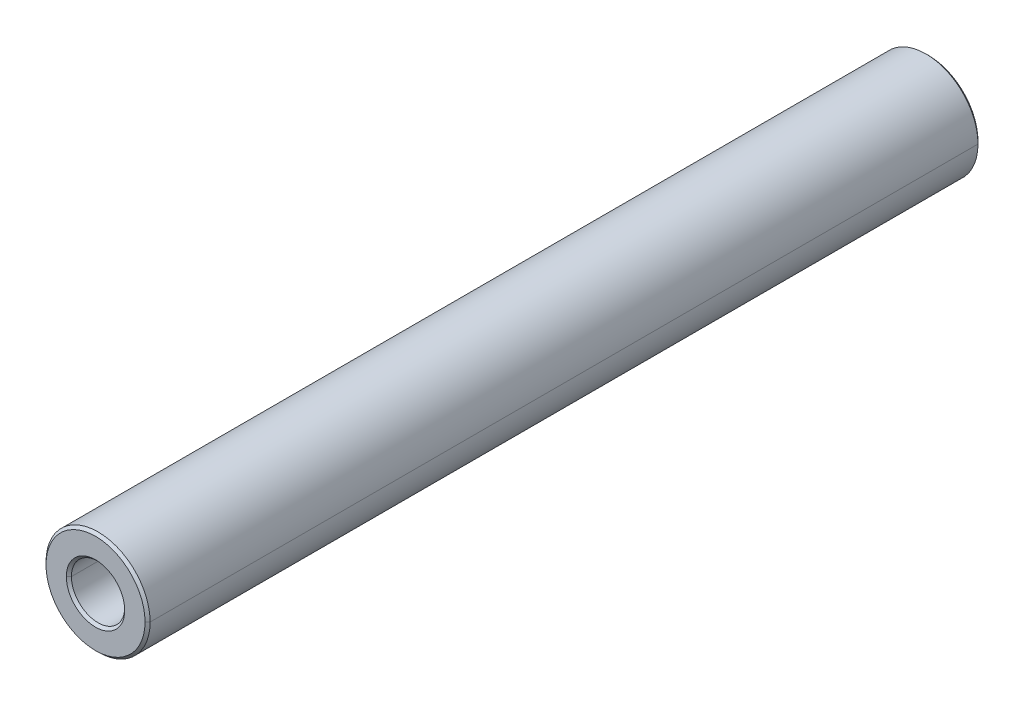
ISO-10303-21;
HEADER;
FILE_DESCRIPTION(('STEP AP214'),'2;1');
FILE_NAME('part.step','',(''),(''),'','','');
FILE_SCHEMA(('AUTOMOTIVE_DESIGN { 1 0 10303 214 1 1 1 1 }'));
ENDSEC;
DATA;
#1=APPLICATION_CONTEXT('core data for automotive mechanical design processes');
#2=APPLICATION_PROTOCOL_DEFINITION('international standard','automotive_design',2000,#1);
#3=PRODUCT_CONTEXT('',#1,'mechanical');
#4=PRODUCT('Part','Part','',(#3));
#5=PRODUCT_RELATED_PRODUCT_CATEGORY('part','',(#4));
#6=PRODUCT_DEFINITION_FORMATION('','',#4);
#7=PRODUCT_DEFINITION_CONTEXT('part definition',#1,'design');
#8=PRODUCT_DEFINITION('design','',#6,#7);
#9=PRODUCT_DEFINITION_SHAPE('','',#8);
#10=(LENGTH_UNIT() NAMED_UNIT(*) SI_UNIT(.MILLI.,.METRE.));
#11=(NAMED_UNIT(*) PLANE_ANGLE_UNIT() SI_UNIT($,.RADIAN.));
#12=(NAMED_UNIT(*) SI_UNIT($,.STERADIAN.) SOLID_ANGLE_UNIT());
#13=UNCERTAINTY_MEASURE_WITH_UNIT(LENGTH_MEASURE(1.E-05),#10,'distance_accuracy_value','');
#14=(GEOMETRIC_REPRESENTATION_CONTEXT(3) GLOBAL_UNCERTAINTY_ASSIGNED_CONTEXT((#13)) GLOBAL_UNIT_ASSIGNED_CONTEXT((#10,
#11,#12)) REPRESENTATION_CONTEXT('',''));
#15=CARTESIAN_POINT('',(0.,0.,0.));
#16=DIRECTION('',(0.,0.,1.));
#17=DIRECTION('',(1.,0.,0.));
#18=AXIS2_PLACEMENT_3D('',#15,#16,#17);
#19=CARTESIAN_POINT('',(0.,0.,-38.1));
#20=DIRECTION('',(0.,0.,-1.));
#21=DIRECTION('',(-1.,0.,0.));
#22=AXIS2_PLACEMENT_3D('',#19,#20,#21);
#23=CONICAL_SURFACE('',#22,2.67081,0.785398163397462);
#24=DIRECTION('',(0.707106781186558,0.,-0.707106781186538));
#25=VECTOR('',#24,1.);
#26=CARTESIAN_POINT('',(2.67081,0.,-38.1));
#27=LINE('',#26,#25);
#28=CARTESIAN_POINT('',(2.4384,0.,-37.86759));
#29=VERTEX_POINT('',#28);
#30=CARTESIAN_POINT('',(2.67081,0.,-38.1));
#31=VERTEX_POINT('',#30);
#32=EDGE_CURVE('E232',#29,#31,#27,.T.);
#33=ORIENTED_EDGE('',*,*,#32,.F.);
#34=CARTESIAN_POINT('',(0.,0.,-37.86759));
#35=DIRECTION('',(0.,0.,-1.));
#36=DIRECTION('',(1.,0.,0.));
#37=AXIS2_PLACEMENT_3D('',#34,#35,#36);
#38=CIRCLE('',#37,2.4384);
#39=CARTESIAN_POINT('',(-2.4384,0.,-37.86759));
#40=VERTEX_POINT('',#39);
#41=EDGE_CURVE('E134',#40,#29,#38,.T.);
#42=ORIENTED_EDGE('',*,*,#41,.F.);
#43=DIRECTION('',(-0.707106781186558,0.,-0.707106781186538));
#44=VECTOR('',#43,1.);
#45=CARTESIAN_POINT('',(-2.67081,0.,-38.1));
#46=LINE('',#45,#44);
#47=CARTESIAN_POINT('',(-2.67081,0.,-38.1));
#48=VERTEX_POINT('',#47);
#49=EDGE_CURVE('E175',#40,#48,#46,.T.);
#50=ORIENTED_EDGE('',*,*,#49,.T.);
#51=CARTESIAN_POINT('',(0.,0.,-38.1));
#52=DIRECTION('',(0.,0.,1.));
#53=DIRECTION('',(1.,0.,0.));
#54=AXIS2_PLACEMENT_3D('',#51,#52,#53);
#55=CIRCLE('',#54,2.67081);
#56=EDGE_CURVE('E130',#31,#48,#55,.T.);
#57=ORIENTED_EDGE('',*,*,#56,.F.);
#58=EDGE_LOOP('',(#33,#42,#50,#57));
#59=FACE_BOUND('',#58,.T.);
#60=ADVANCED_FACE('F17',(#59),#23,.F.);
#61=CARTESIAN_POINT('',(0.,0.,37.86759));
#62=DIRECTION('',(0.,0.,1.));
#63=DIRECTION('',(1.,0.,0.));
#64=AXIS2_PLACEMENT_3D('',#61,#62,#63);
#65=CONICAL_SURFACE('',#64,2.4384,0.785398163397462);
#66=DIRECTION('',(-0.707106781186558,0.,0.707106781186538));
#67=VECTOR('',#66,1.);
#68=CARTESIAN_POINT('',(-2.4384,0.,37.86759));
#69=LINE('',#68,#67);
#70=CARTESIAN_POINT('',(-2.4384,0.,37.86759));
#71=VERTEX_POINT('',#70);
#72=CARTESIAN_POINT('',(-2.67081000000007,0.,38.1));
#73=VERTEX_POINT('',#72);
#74=EDGE_CURVE('E165',#71,#73,#69,.T.);
#75=ORIENTED_EDGE('',*,*,#74,.F.);
#76=CARTESIAN_POINT('',(0.,0.,37.86759));
#77=DIRECTION('',(0.,0.,1.));
#78=DIRECTION('',(1.,0.,0.));
#79=AXIS2_PLACEMENT_3D('',#76,#77,#78);
#80=CIRCLE('',#79,2.4384);
#81=CARTESIAN_POINT('',(2.4384,0.,37.86759));
#82=VERTEX_POINT('',#81);
#83=EDGE_CURVE('E85',#82,#71,#80,.T.);
#84=ORIENTED_EDGE('',*,*,#83,.F.);
#85=DIRECTION('',(0.707106781186558,0.,0.707106781186538));
#86=VECTOR('',#85,1.);
#87=CARTESIAN_POINT('',(2.4384,0.,37.86759));
#88=LINE('',#87,#86);
#89=CARTESIAN_POINT('',(2.67081000000007,0.,38.1));
#90=VERTEX_POINT('',#89);
#91=EDGE_CURVE('E173',#82,#90,#88,.T.);
#92=ORIENTED_EDGE('',*,*,#91,.T.);
#93=CARTESIAN_POINT('',(0.,0.,38.1));
#94=DIRECTION('',(0.,0.,-1.));
#95=DIRECTION('',(1.,0.,0.));
#96=AXIS2_PLACEMENT_3D('',#93,#94,#95);
#97=CIRCLE('',#96,2.67081000000007);
#98=EDGE_CURVE('E11',#73,#90,#97,.T.);
#99=ORIENTED_EDGE('',*,*,#98,.F.);
#100=EDGE_LOOP('',(#75,#84,#92,#99));
#101=FACE_BOUND('',#100,.T.);
#102=ADVANCED_FACE('F19',(#101),#65,.F.);
#103=CARTESIAN_POINT('',(0.,0.,-37.86759));
#104=DIRECTION('',(0.,0.,1.));
#105=DIRECTION('',(1.,0.,0.));
#106=AXIS2_PLACEMENT_3D('',#103,#104,#105);
#107=CONICAL_SURFACE('',#106,4.7625,0.785398163397445);
#108=DIRECTION('',(-0.707106781186545,0.,0.70710678118655));
#109=VECTOR('',#108,1.);
#110=CARTESIAN_POINT('',(-4.7625,0.,-37.86759));
#111=LINE('',#110,#109);
#112=CARTESIAN_POINT('',(-4.53009,0.,-38.1));
#113=VERTEX_POINT('',#112);
#114=CARTESIAN_POINT('',(-4.7625,0.,-37.86759));
#115=VERTEX_POINT('',#114);
#116=EDGE_CURVE('E188',#113,#115,#111,.T.);
#117=ORIENTED_EDGE('',*,*,#116,.F.);
#118=CARTESIAN_POINT('',(0.,0.,-38.1));
#119=DIRECTION('',(0.,0.,-1.));
#120=DIRECTION('',(1.,0.,0.));
#121=AXIS2_PLACEMENT_3D('',#118,#119,#120);
#122=CIRCLE('',#121,4.53009);
#123=CARTESIAN_POINT('',(4.53009,0.,-38.1));
#124=VERTEX_POINT('',#123);
#125=EDGE_CURVE('E126',#124,#113,#122,.T.);
#126=ORIENTED_EDGE('',*,*,#125,.F.);
#127=DIRECTION('',(0.707106781186545,0.,0.70710678118655));
#128=VECTOR('',#127,1.);
#129=CARTESIAN_POINT('',(4.7625,0.,-37.86759));
#130=LINE('',#129,#128);
#131=CARTESIAN_POINT('',(4.7625,0.,-37.86759));
#132=VERTEX_POINT('',#131);
#133=EDGE_CURVE('E96',#124,#132,#130,.T.);
#134=ORIENTED_EDGE('',*,*,#133,.T.);
#135=CARTESIAN_POINT('',(0.,0.,-37.86759));
#136=DIRECTION('',(0.,0.,1.));
#137=DIRECTION('',(1.,0.,0.));
#138=AXIS2_PLACEMENT_3D('',#135,#136,#137);
#139=CIRCLE('',#138,4.7625);
#140=EDGE_CURVE('E121',#115,#132,#139,.T.);
#141=ORIENTED_EDGE('',*,*,#140,.F.);
#142=EDGE_LOOP('',(#117,#126,#134,#141));
#143=FACE_BOUND('',#142,.T.);
#144=ADVANCED_FACE('F255',(#143),#107,.T.);
#145=CARTESIAN_POINT('',(0.,0.,38.1));
#146=DIRECTION('',(0.,0.,-1.));
#147=DIRECTION('',(-1.,0.,0.));
#148=AXIS2_PLACEMENT_3D('',#145,#146,#147);
#149=CONICAL_SURFACE('',#148,4.53009,0.785398163397445);
#150=DIRECTION('',(0.707106781186545,0.,-0.70710678118655));
#151=VECTOR('',#150,1.);
#152=CARTESIAN_POINT('',(4.53009,0.,38.1));
#153=LINE('',#152,#151);
#154=CARTESIAN_POINT('',(4.53009,0.,38.1));
#155=VERTEX_POINT('',#154);
#156=CARTESIAN_POINT('',(4.7625,0.,37.86759));
#157=VERTEX_POINT('',#156);
#158=EDGE_CURVE('E80',#155,#157,#153,.T.);
#159=ORIENTED_EDGE('',*,*,#158,.F.);
#160=CARTESIAN_POINT('',(0.,0.,38.1));
#161=DIRECTION('',(0.,0.,1.));
#162=DIRECTION('',(1.,0.,0.));
#163=AXIS2_PLACEMENT_3D('',#160,#161,#162);
#164=CIRCLE('',#163,4.53009);
#165=CARTESIAN_POINT('',(-4.53009,0.,38.1));
#166=VERTEX_POINT('',#165);
#167=EDGE_CURVE('E27',#166,#155,#164,.T.);
#168=ORIENTED_EDGE('',*,*,#167,.F.);
#169=DIRECTION('',(-0.707106781186545,0.,-0.70710678118655));
#170=VECTOR('',#169,1.);
#171=CARTESIAN_POINT('',(-4.53009,0.,38.1));
#172=LINE('',#171,#170);
#173=CARTESIAN_POINT('',(-4.7625,0.,37.86759));
#174=VERTEX_POINT('',#173);
#175=EDGE_CURVE('E77',#166,#174,#172,.T.);
#176=ORIENTED_EDGE('',*,*,#175,.T.);
#177=CARTESIAN_POINT('',(0.,0.,37.86759));
#178=DIRECTION('',(0.,0.,-1.));
#179=DIRECTION('',(1.,0.,0.));
#180=AXIS2_PLACEMENT_3D('',#177,#178,#179);
#181=CIRCLE('',#180,4.7625);
#182=EDGE_CURVE('E40',#157,#174,#181,.T.);
#183=ORIENTED_EDGE('',*,*,#182,.F.);
#184=EDGE_LOOP('',(#159,#168,#176,#183));
#185=FACE_BOUND('',#184,.T.);
#186=ADVANCED_FACE('F76',(#185),#149,.T.);
#187=CARTESIAN_POINT('',(0.,0.,38.1));
#188=DIRECTION('',(0.,0.,1.));
#189=DIRECTION('',(1.,0.,0.));
#190=AXIS2_PLACEMENT_3D('',#187,#188,#189);
#191=PLANE('',#190);
#192=CARTESIAN_POINT('',(0.,0.,38.1));
#193=DIRECTION('',(0.,0.,-1.));
#194=DIRECTION('',(1.,0.,0.));
#195=AXIS2_PLACEMENT_3D('',#192,#193,#194);
#196=CIRCLE('',#195,2.67081000000007);
#197=EDGE_CURVE('E170',#90,#73,#196,.T.);
#198=ORIENTED_EDGE('',*,*,#197,.T.);
#199=ORIENTED_EDGE('',*,*,#98,.T.);
#200=EDGE_LOOP('',(#198,#199));
#201=FACE_BOUND('',#200,.T.);
#202=ORIENTED_EDGE('',*,*,#167,.T.);
#203=CARTESIAN_POINT('',(0.,0.,38.1));
#204=DIRECTION('',(0.,0.,1.));
#205=DIRECTION('',(1.,0.,0.));
#206=AXIS2_PLACEMENT_3D('',#203,#204,#205);
#207=CIRCLE('',#206,4.53009);
#208=EDGE_CURVE('E88',#155,#166,#207,.T.);
#209=ORIENTED_EDGE('',*,*,#208,.T.);
#210=EDGE_LOOP('',(#202,#209));
#211=FACE_BOUND('',#210,.T.);
#212=ADVANCED_FACE('F94',(#201,#211),#191,.T.);
#213=CARTESIAN_POINT('',(0.,0.,-38.1));
#214=DIRECTION('',(0.,0.,1.));
#215=DIRECTION('',(1.,0.,0.));
#216=AXIS2_PLACEMENT_3D('',#213,#214,#215);
#217=CYLINDRICAL_SURFACE('',#216,2.4384);
#218=DIRECTION('',(0.,0.,1.));
#219=VECTOR('',#218,1.);
#220=CARTESIAN_POINT('',(-2.4384,0.,-38.1));
#221=LINE('',#220,#219);
#222=EDGE_CURVE('E92',#40,#71,#221,.T.);
#223=ORIENTED_EDGE('',*,*,#222,.F.);
#224=ORIENTED_EDGE('',*,*,#41,.T.);
#225=DIRECTION('',(0.,0.,1.));
#226=VECTOR('',#225,1.);
#227=CARTESIAN_POINT('',(2.4384,0.,-38.1));
#228=LINE('',#227,#226);
#229=EDGE_CURVE('E111',#29,#82,#228,.T.);
#230=ORIENTED_EDGE('',*,*,#229,.T.);
#231=ORIENTED_EDGE('',*,*,#83,.T.);
#232=EDGE_LOOP('',(#223,#224,#230,#231));
#233=FACE_BOUND('',#232,.T.);
#234=ADVANCED_FACE('F145',(#233),#217,.F.);
#235=CARTESIAN_POINT('',(0.,0.,-38.1));
#236=DIRECTION('',(0.,0.,1.));
#237=DIRECTION('',(1.,0.,0.));
#238=AXIS2_PLACEMENT_3D('',#235,#236,#237);
#239=PLANE('',#238);
#240=CARTESIAN_POINT('',(0.,0.,-38.1));
#241=DIRECTION('',(0.,0.,1.));
#242=DIRECTION('',(1.,0.,0.));
#243=AXIS2_PLACEMENT_3D('',#240,#241,#242);
#244=CIRCLE('',#243,2.67081);
#245=EDGE_CURVE('E180',#48,#31,#244,.T.);
#246=ORIENTED_EDGE('',*,*,#245,.T.);
#247=ORIENTED_EDGE('',*,*,#56,.T.);
#248=EDGE_LOOP('',(#246,#247));
#249=FACE_BOUND('',#248,.T.);
#250=ORIENTED_EDGE('',*,*,#125,.T.);
#251=CARTESIAN_POINT('',(0.,0.,-38.1));
#252=DIRECTION('',(0.,0.,-1.));
#253=DIRECTION('',(1.,0.,0.));
#254=AXIS2_PLACEMENT_3D('',#251,#252,#253);
#255=CIRCLE('',#254,4.53009);
#256=EDGE_CURVE('E192',#113,#124,#255,.T.);
#257=ORIENTED_EDGE('',*,*,#256,.T.);
#258=EDGE_LOOP('',(#250,#257));
#259=FACE_BOUND('',#258,.T.);
#260=ADVANCED_FACE('F199',(#249,#259),#239,.F.);
#261=CARTESIAN_POINT('',(0.,0.,-38.1));
#262=DIRECTION('',(0.,0.,1.));
#263=DIRECTION('',(1.,0.,0.));
#264=AXIS2_PLACEMENT_3D('',#261,#262,#263);
#265=CYLINDRICAL_SURFACE('',#264,4.7625);
#266=DIRECTION('',(0.,0.,1.));
#267=VECTOR('',#266,1.);
#268=CARTESIAN_POINT('',(-4.7625,0.,-38.1));
#269=LINE('',#268,#267);
#270=EDGE_CURVE('E115',#115,#174,#269,.T.);
#271=ORIENTED_EDGE('',*,*,#270,.F.);
#272=ORIENTED_EDGE('',*,*,#140,.T.);
#273=DIRECTION('',(0.,0.,1.));
#274=VECTOR('',#273,1.);
#275=CARTESIAN_POINT('',(4.7625,0.,-38.1));
#276=LINE('',#275,#274);
#277=EDGE_CURVE('E118',#132,#157,#276,.T.);
#278=ORIENTED_EDGE('',*,*,#277,.T.);
#279=ORIENTED_EDGE('',*,*,#182,.T.);
#280=EDGE_LOOP('',(#271,#272,#278,#279));
#281=FACE_BOUND('',#280,.T.);
#282=ADVANCED_FACE('F273',(#281),#265,.T.);
#283=CARTESIAN_POINT('',(0.,0.,-38.1));
#284=DIRECTION('',(0.,0.,1.));
#285=DIRECTION('',(1.,0.,0.));
#286=AXIS2_PLACEMENT_3D('',#283,#284,#285);
#287=CYLINDRICAL_SURFACE('',#286,4.7625);
#288=CARTESIAN_POINT('',(0.,0.,-37.86759));
#289=DIRECTION('',(0.,0.,1.));
#290=DIRECTION('',(1.,0.,0.));
#291=AXIS2_PLACEMENT_3D('',#288,#289,#290);
#292=CIRCLE('',#291,4.7625);
#293=EDGE_CURVE('E104',#132,#115,#292,.T.);
#294=ORIENTED_EDGE('',*,*,#293,.T.);
#295=ORIENTED_EDGE('',*,*,#270,.T.);
#296=CARTESIAN_POINT('',(0.,0.,37.86759));
#297=DIRECTION('',(0.,0.,-1.));
#298=DIRECTION('',(1.,0.,0.));
#299=AXIS2_PLACEMENT_3D('',#296,#297,#298);
#300=CIRCLE('',#299,4.7625);
#301=EDGE_CURVE('E90',#174,#157,#300,.T.);
#302=ORIENTED_EDGE('',*,*,#301,.T.);
#303=ORIENTED_EDGE('',*,*,#277,.F.);
#304=EDGE_LOOP('',(#294,#295,#302,#303));
#305=FACE_BOUND('',#304,.T.);
#306=ADVANCED_FACE('F270',(#305),#287,.T.);
#307=CARTESIAN_POINT('',(0.,0.,-38.1));
#308=DIRECTION('',(0.,0.,1.));
#309=DIRECTION('',(1.,0.,0.));
#310=AXIS2_PLACEMENT_3D('',#307,#308,#309);
#311=CYLINDRICAL_SURFACE('',#310,2.4384);
#312=CARTESIAN_POINT('',(0.,0.,-37.86759));
#313=DIRECTION('',(0.,0.,-1.));
#314=DIRECTION('',(1.,0.,0.));
#315=AXIS2_PLACEMENT_3D('',#312,#313,#314);
#316=CIRCLE('',#315,2.4384);
#317=EDGE_CURVE('E163',#29,#40,#316,.T.);
#318=ORIENTED_EDGE('',*,*,#317,.T.);
#319=ORIENTED_EDGE('',*,*,#222,.T.);
#320=CARTESIAN_POINT('',(0.,0.,37.86759));
#321=DIRECTION('',(0.,0.,1.));
#322=DIRECTION('',(1.,0.,0.));
#323=AXIS2_PLACEMENT_3D('',#320,#321,#322);
#324=CIRCLE('',#323,2.4384);
#325=EDGE_CURVE('E161',#71,#82,#324,.T.);
#326=ORIENTED_EDGE('',*,*,#325,.T.);
#327=ORIENTED_EDGE('',*,*,#229,.F.);
#328=EDGE_LOOP('',(#318,#319,#326,#327));
#329=FACE_BOUND('',#328,.T.);
#330=ADVANCED_FACE('F159',(#329),#311,.F.);
#331=CARTESIAN_POINT('',(0.,0.,38.1));
#332=DIRECTION('',(0.,0.,-1.));
#333=DIRECTION('',(-1.,0.,0.));
#334=AXIS2_PLACEMENT_3D('',#331,#332,#333);
#335=CONICAL_SURFACE('',#334,4.53009,0.785398163397445);
#336=ORIENTED_EDGE('',*,*,#208,.F.);
#337=ORIENTED_EDGE('',*,*,#158,.T.);
#338=ORIENTED_EDGE('',*,*,#301,.F.);
#339=ORIENTED_EDGE('',*,*,#175,.F.);
#340=EDGE_LOOP('',(#336,#337,#338,#339));
#341=FACE_BOUND('',#340,.T.);
#342=ADVANCED_FACE('F87',(#341),#335,.T.);
#343=CARTESIAN_POINT('',(0.,0.,-37.86759));
#344=DIRECTION('',(0.,0.,1.));
#345=DIRECTION('',(1.,0.,0.));
#346=AXIS2_PLACEMENT_3D('',#343,#344,#345);
#347=CONICAL_SURFACE('',#346,4.7625,0.785398163397445);
#348=ORIENTED_EDGE('',*,*,#256,.F.);
#349=ORIENTED_EDGE('',*,*,#116,.T.);
#350=ORIENTED_EDGE('',*,*,#293,.F.);
#351=ORIENTED_EDGE('',*,*,#133,.F.);
#352=EDGE_LOOP('',(#348,#349,#350,#351));
#353=FACE_BOUND('',#352,.T.);
#354=ADVANCED_FACE('F203',(#353),#347,.T.);
#355=CARTESIAN_POINT('',(0.,0.,37.86759));
#356=DIRECTION('',(0.,0.,1.));
#357=DIRECTION('',(1.,0.,0.));
#358=AXIS2_PLACEMENT_3D('',#355,#356,#357);
#359=CONICAL_SURFACE('',#358,2.4384,0.785398163397462);
#360=ORIENTED_EDGE('',*,*,#325,.F.);
#361=ORIENTED_EDGE('',*,*,#74,.T.);
#362=ORIENTED_EDGE('',*,*,#197,.F.);
#363=ORIENTED_EDGE('',*,*,#91,.F.);
#364=EDGE_LOOP('',(#360,#361,#362,#363));
#365=FACE_BOUND('',#364,.T.);
#366=ADVANCED_FACE('F172',(#365),#359,.F.);
#367=CARTESIAN_POINT('',(0.,0.,-38.1));
#368=DIRECTION('',(0.,0.,-1.));
#369=DIRECTION('',(-1.,0.,0.));
#370=AXIS2_PLACEMENT_3D('',#367,#368,#369);
#371=CONICAL_SURFACE('',#370,2.67081,0.785398163397462);
#372=ORIENTED_EDGE('',*,*,#317,.F.);
#373=ORIENTED_EDGE('',*,*,#32,.T.);
#374=ORIENTED_EDGE('',*,*,#245,.F.);
#375=ORIENTED_EDGE('',*,*,#49,.F.);
#376=EDGE_LOOP('',(#372,#373,#374,#375));
#377=FACE_BOUND('',#376,.T.);
#378=ADVANCED_FACE('F236',(#377),#371,.F.);
#379=CLOSED_SHELL('',(#60,#102,#144,#186,#212,#234,#260,#282,#306,#330,#342,#354,#366,#378));
#380=MANIFOLD_SOLID_BREP('B1',#379);
#381=ADVANCED_BREP_SHAPE_REPRESENTATION('',(#18,#380),#14);
#382=SHAPE_DEFINITION_REPRESENTATION(#9,#381);
ENDSEC;
END-ISO-10303-21;
